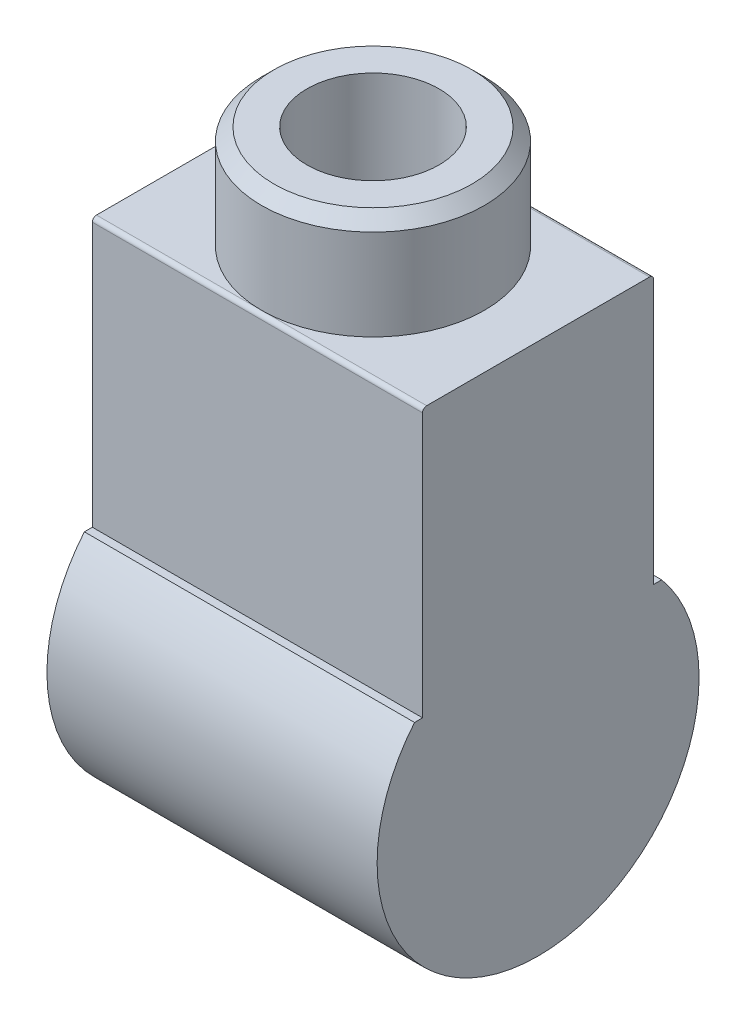
ISO-10303-21;
HEADER;
FILE_DESCRIPTION(('STEP AP214'),'2;1');
FILE_NAME('part.step','',(''),(''),'','','');
FILE_SCHEMA(('AUTOMOTIVE_DESIGN { 1 0 10303 214 1 1 1 1 }'));
ENDSEC;
DATA;
#1=APPLICATION_CONTEXT('core data for automotive mechanical design processes');
#2=APPLICATION_PROTOCOL_DEFINITION('international standard','automotive_design',2000,#1);
#3=PRODUCT_CONTEXT('',#1,'mechanical');
#4=PRODUCT('Part','Part','',(#3));
#5=PRODUCT_RELATED_PRODUCT_CATEGORY('part','',(#4));
#6=PRODUCT_DEFINITION_FORMATION('','',#4);
#7=PRODUCT_DEFINITION_CONTEXT('part definition',#1,'design');
#8=PRODUCT_DEFINITION('design','',#6,#7);
#9=PRODUCT_DEFINITION_SHAPE('','',#8);
#10=(LENGTH_UNIT() NAMED_UNIT(*) SI_UNIT(.MILLI.,.METRE.));
#11=(NAMED_UNIT(*) PLANE_ANGLE_UNIT() SI_UNIT($,.RADIAN.));
#12=(NAMED_UNIT(*) SI_UNIT($,.STERADIAN.) SOLID_ANGLE_UNIT());
#13=UNCERTAINTY_MEASURE_WITH_UNIT(LENGTH_MEASURE(1.E-05),#10,'distance_accuracy_value','');
#14=(GEOMETRIC_REPRESENTATION_CONTEXT(3) GLOBAL_UNCERTAINTY_ASSIGNED_CONTEXT((#13)) GLOBAL_UNIT_ASSIGNED_CONTEXT((#10,
#11,#12)) REPRESENTATION_CONTEXT('',''));
#15=CARTESIAN_POINT('',(0.,0.,0.));
#16=DIRECTION('',(0.,0.,1.));
#17=DIRECTION('',(1.,0.,0.));
#18=AXIS2_PLACEMENT_3D('',#15,#16,#17);
#19=CARTESIAN_POINT('',(2.,4.44999999999991,-1.34999999999991));
#20=DIRECTION('',(-1.,0.,0.));
#21=DIRECTION('',(0.,0.,1.));
#22=AXIS2_PLACEMENT_3D('',#19,#20,#21);
#23=CYLINDRICAL_SURFACE('',#22,0.0500000000000934);
#24=DIRECTION('',(1.,0.,0.));
#25=VECTOR('',#24,1.);
#26=CARTESIAN_POINT('',(2.,4.5,-1.34999999999991));
#27=LINE('',#26,#25);
#28=CARTESIAN_POINT('',(0.,4.5,-1.34999999999995));
#29=VERTEX_POINT('',#28);
#30=CARTESIAN_POINT('',(2.,4.5,-1.34999999999991));
#31=VERTEX_POINT('',#30);
#32=EDGE_CURVE('E156',#29,#31,#27,.T.);
#33=ORIENTED_EDGE('',*,*,#32,.T.);
#34=CARTESIAN_POINT('',(2.,4.44999999999991,-1.34999999999991));
#35=DIRECTION('',(-1.,0.,0.));
#36=DIRECTION('',(0.,0.,1.));
#37=AXIS2_PLACEMENT_3D('',#34,#35,#36);
#38=CIRCLE('',#37,0.0500000000000934);
#39=CARTESIAN_POINT('',(2.,4.44999999999991,-1.4));
#40=VERTEX_POINT('',#39);
#41=EDGE_CURVE('E205',#31,#40,#38,.T.);
#42=ORIENTED_EDGE('',*,*,#41,.T.);
#43=DIRECTION('',(1.,0.,0.));
#44=VECTOR('',#43,1.);
#45=CARTESIAN_POINT('',(2.,4.44999999999991,-1.4));
#46=LINE('',#45,#44);
#47=CARTESIAN_POINT('',(-2.,4.44999999999991,-1.4));
#48=VERTEX_POINT('',#47);
#49=EDGE_CURVE('E142',#40,#48,#46,.F.);
#50=ORIENTED_EDGE('',*,*,#49,.T.);
#51=CARTESIAN_POINT('',(-2.,4.44999999999991,-1.34999999999991));
#52=DIRECTION('',(-1.,0.,0.));
#53=DIRECTION('',(0.,0.,1.));
#54=AXIS2_PLACEMENT_3D('',#51,#52,#53);
#55=CIRCLE('',#54,0.0500000000000934);
#56=CARTESIAN_POINT('',(-2.,4.5,-1.34999999999991));
#57=VERTEX_POINT('',#56);
#58=EDGE_CURVE('E19',#48,#57,#55,.F.);
#59=ORIENTED_EDGE('',*,*,#58,.T.);
#60=DIRECTION('',(1.,0.,0.));
#61=VECTOR('',#60,1.);
#62=CARTESIAN_POINT('',(2.,4.5,-1.34999999999991));
#63=LINE('',#62,#61);
#64=EDGE_CURVE('E135',#57,#29,#63,.T.);
#65=ORIENTED_EDGE('',*,*,#64,.T.);
#66=EDGE_LOOP('',(#33,#42,#50,#59,#65));
#67=FACE_BOUND('',#66,.T.);
#68=ADVANCED_FACE('F16',(#67),#23,.T.);
#69=CARTESIAN_POINT('',(0.,4.45,0.));
#70=DIRECTION('',(0.,1.,0.));
#71=DIRECTION('',(0.,0.,1.));
#72=AXIS2_PLACEMENT_3D('',#69,#70,#71);
#73=CYLINDRICAL_SURFACE('',#72,1.35);
#74=CARTESIAN_POINT('',(0.,4.5,0.));
#75=DIRECTION('',(0.,1.,0.));
#76=DIRECTION('',(0.,0.,1.));
#77=AXIS2_PLACEMENT_3D('',#74,#75,#76);
#78=CIRCLE('',#77,1.35);
#79=CARTESIAN_POINT('',(0.,4.5,1.34999999999995));
#80=VERTEX_POINT('',#79);
#81=EDGE_CURVE('E151',#80,#29,#78,.T.);
#82=ORIENTED_EDGE('',*,*,#81,.T.);
#83=CARTESIAN_POINT('',(0.,4.5,0.));
#84=DIRECTION('',(0.,1.,0.));
#85=DIRECTION('',(0.,0.,1.));
#86=AXIS2_PLACEMENT_3D('',#83,#84,#85);
#87=CIRCLE('',#86,1.35);
#88=EDGE_CURVE('E101',#29,#80,#87,.T.);
#89=ORIENTED_EDGE('',*,*,#88,.T.);
#90=EDGE_LOOP('',(#82,#89));
#91=FACE_BOUND('',#90,.T.);
#92=CARTESIAN_POINT('',(0.,5.60000000001537,0.));
#93=DIRECTION('',(0.,-1.,0.));
#94=DIRECTION('',(0.,0.,-1.));
#95=AXIS2_PLACEMENT_3D('',#92,#93,#94);
#96=CIRCLE('',#95,1.35000000000218);
#97=CARTESIAN_POINT('',(0.,5.60000000001537,-1.35000000000218));
#98=VERTEX_POINT('',#97);
#99=EDGE_CURVE('E165',#98,#98,#96,.F.);
#100=ORIENTED_EDGE('',*,*,#99,.F.);
#101=EDGE_LOOP('',(#100));
#102=FACE_BOUND('',#101,.T.);
#103=ADVANCED_FACE('F235',(#91,#102),#73,.T.);
#104=CARTESIAN_POINT('',(2.,4.44999999999991,1.34999999999991));
#105=DIRECTION('',(-1.,0.,0.));
#106=DIRECTION('',(0.,0.,1.));
#107=AXIS2_PLACEMENT_3D('',#104,#105,#106);
#108=CYLINDRICAL_SURFACE('',#107,0.0500000000000934);
#109=DIRECTION('',(-1.,0.,0.));
#110=VECTOR('',#109,1.);
#111=CARTESIAN_POINT('',(2.,4.44999999999991,1.4));
#112=LINE('',#111,#110);
#113=CARTESIAN_POINT('',(-2.,4.44999999999991,1.4));
#114=VERTEX_POINT('',#113);
#115=CARTESIAN_POINT('',(2.,4.44999999999991,1.4));
#116=VERTEX_POINT('',#115);
#117=EDGE_CURVE('E100',#114,#116,#112,.F.);
#118=ORIENTED_EDGE('',*,*,#117,.T.);
#119=CARTESIAN_POINT('',(2.,4.44999999999991,1.34999999999991));
#120=DIRECTION('',(-1.,0.,0.));
#121=DIRECTION('',(0.,0.,1.));
#122=AXIS2_PLACEMENT_3D('',#119,#120,#121);
#123=CIRCLE('',#122,0.0500000000000934);
#124=CARTESIAN_POINT('',(2.,4.5,1.34999999999991));
#125=VERTEX_POINT('',#124);
#126=EDGE_CURVE('E113',#116,#125,#123,.T.);
#127=ORIENTED_EDGE('',*,*,#126,.T.);
#128=DIRECTION('',(1.,0.,0.));
#129=VECTOR('',#128,1.);
#130=CARTESIAN_POINT('',(2.,4.5,1.34999999999991));
#131=LINE('',#130,#129);
#132=EDGE_CURVE('E154',#125,#80,#131,.F.);
#133=ORIENTED_EDGE('',*,*,#132,.T.);
#134=DIRECTION('',(1.,0.,0.));
#135=VECTOR('',#134,1.);
#136=CARTESIAN_POINT('',(2.,4.5,1.34999999999991));
#137=LINE('',#136,#135);
#138=CARTESIAN_POINT('',(-2.,4.5,1.34999999999991));
#139=VERTEX_POINT('',#138);
#140=EDGE_CURVE('E138',#80,#139,#137,.F.);
#141=ORIENTED_EDGE('',*,*,#140,.T.);
#142=CARTESIAN_POINT('',(-2.,4.44999999999991,1.34999999999991));
#143=DIRECTION('',(-1.,0.,0.));
#144=DIRECTION('',(0.,0.,1.));
#145=AXIS2_PLACEMENT_3D('',#142,#143,#144);
#146=CIRCLE('',#145,0.0500000000000934);
#147=EDGE_CURVE('E204',#139,#114,#146,.F.);
#148=ORIENTED_EDGE('',*,*,#147,.T.);
#149=EDGE_LOOP('',(#118,#127,#133,#141,#148));
#150=FACE_BOUND('',#149,.T.);
#151=ADVANCED_FACE('F233',(#150),#108,.T.);
#152=CARTESIAN_POINT('',(0.,5.60000000001537,0.));
#153=DIRECTION('',(0.,-1.,0.));
#154=DIRECTION('',(0.,0.,-1.));
#155=AXIS2_PLACEMENT_3D('',#152,#153,#154);
#156=CONICAL_SURFACE('',#155,1.35000000000218,0.785398163397448);
#157=CARTESIAN_POINT('',(0.,5.75000000003456,0.));
#158=DIRECTION('',(0.,-1.,0.));
#159=DIRECTION('',(0.,0.,-1.));
#160=AXIS2_PLACEMENT_3D('',#157,#158,#159);
#161=CIRCLE('',#160,1.19999999998299);
#162=CARTESIAN_POINT('',(0.,5.75000000003456,-1.19999999998299));
#163=VERTEX_POINT('',#162);
#164=EDGE_CURVE('E131',#163,#163,#161,.T.);
#165=ORIENTED_EDGE('',*,*,#164,.T.);
#166=EDGE_LOOP('',(#165));
#167=FACE_BOUND('',#166,.T.);
#168=ORIENTED_EDGE('',*,*,#99,.T.);
#169=EDGE_LOOP('',(#168));
#170=FACE_BOUND('',#169,.T.);
#171=ADVANCED_FACE('F240',(#167,#170),#156,.T.);
#172=CARTESIAN_POINT('',(2.,1.25,-1.4966629547096));
#173=DIRECTION('',(0.,-1.,0.));
#174=DIRECTION('',(0.,0.,-1.));
#175=AXIS2_PLACEMENT_3D('',#172,#173,#174);
#176=PLANE('',#175);
#177=DIRECTION('',(0.,0.,-1.));
#178=VECTOR('',#177,1.);
#179=CARTESIAN_POINT('',(-2.,1.25,-1.4966629547096));
#180=LINE('',#179,#178);
#181=CARTESIAN_POINT('',(-2.,1.25,-1.4));
#182=VERTEX_POINT('',#181);
#183=CARTESIAN_POINT('',(-2.,1.25,-1.4966629547096));
#184=VERTEX_POINT('',#183);
#185=EDGE_CURVE('E83',#182,#184,#180,.T.);
#186=ORIENTED_EDGE('',*,*,#185,.F.);
#187=DIRECTION('',(1.,0.,0.));
#188=VECTOR('',#187,1.);
#189=CARTESIAN_POINT('',(2.,1.25,-1.4));
#190=LINE('',#189,#188);
#191=CARTESIAN_POINT('',(2.,1.25,-1.4));
#192=VERTEX_POINT('',#191);
#193=EDGE_CURVE('E141',#182,#192,#190,.T.);
#194=ORIENTED_EDGE('',*,*,#193,.T.);
#195=DIRECTION('',(0.,0.,-1.));
#196=VECTOR('',#195,1.);
#197=CARTESIAN_POINT('',(2.,1.25,-1.4966629547096));
#198=LINE('',#197,#196);
#199=CARTESIAN_POINT('',(2.,1.25,-1.4966629547096));
#200=VERTEX_POINT('',#199);
#201=EDGE_CURVE('E160',#200,#192,#198,.F.);
#202=ORIENTED_EDGE('',*,*,#201,.F.);
#203=DIRECTION('',(-1.,0.,0.));
#204=VECTOR('',#203,1.);
#205=CARTESIAN_POINT('',(2.,1.25,-1.4966629547096));
#206=LINE('',#205,#204);
#207=EDGE_CURVE('E126',#184,#200,#206,.F.);
#208=ORIENTED_EDGE('',*,*,#207,.F.);
#209=EDGE_LOOP('',(#186,#194,#202,#208));
#210=FACE_BOUND('',#209,.T.);
#211=ADVANCED_FACE('F225',(#210),#176,.F.);
#212=CARTESIAN_POINT('',(2.,4.5,-1.34999999999991));
#213=DIRECTION('',(0.,-1.,0.));
#214=DIRECTION('',(0.,0.,-1.));
#215=AXIS2_PLACEMENT_3D('',#212,#213,#214);
#216=PLANE('',#215);
#217=ORIENTED_EDGE('',*,*,#132,.F.);
#218=DIRECTION('',(0.,0.,-1.));
#219=VECTOR('',#218,1.);
#220=CARTESIAN_POINT('',(2.,4.5,0.));
#221=LINE('',#220,#219);
#222=EDGE_CURVE('E115',#31,#125,#221,.F.);
#223=ORIENTED_EDGE('',*,*,#222,.F.);
#224=ORIENTED_EDGE('',*,*,#32,.F.);
#225=ORIENTED_EDGE('',*,*,#81,.F.);
#226=EDGE_LOOP('',(#217,#223,#224,#225));
#227=FACE_BOUND('',#226,.T.);
#228=ADVANCED_FACE('F231',(#227),#216,.F.);
#229=CARTESIAN_POINT('',(2.,1.25,1.4));
#230=DIRECTION('',(0.,-1.,0.));
#231=DIRECTION('',(0.,0.,-1.));
#232=AXIS2_PLACEMENT_3D('',#229,#230,#231);
#233=PLANE('',#232);
#234=DIRECTION('',(0.,0.,-1.));
#235=VECTOR('',#234,1.);
#236=CARTESIAN_POINT('',(-2.,1.25,1.4));
#237=LINE('',#236,#235);
#238=CARTESIAN_POINT('',(-2.,1.25,1.4966629547096));
#239=VERTEX_POINT('',#238);
#240=CARTESIAN_POINT('',(-2.,1.25,1.4));
#241=VERTEX_POINT('',#240);
#242=EDGE_CURVE('E144',#239,#241,#237,.T.);
#243=ORIENTED_EDGE('',*,*,#242,.F.);
#244=DIRECTION('',(-1.,0.,0.));
#245=VECTOR('',#244,1.);
#246=CARTESIAN_POINT('',(2.,1.25,1.4966629547096));
#247=LINE('',#246,#245);
#248=CARTESIAN_POINT('',(2.,1.25,1.4966629547096));
#249=VERTEX_POINT('',#248);
#250=EDGE_CURVE('E108',#249,#239,#247,.T.);
#251=ORIENTED_EDGE('',*,*,#250,.F.);
#252=DIRECTION('',(0.,0.,-1.));
#253=VECTOR('',#252,1.);
#254=CARTESIAN_POINT('',(2.,1.25,0.));
#255=LINE('',#254,#253);
#256=CARTESIAN_POINT('',(2.,1.25,1.4));
#257=VERTEX_POINT('',#256);
#258=EDGE_CURVE('E105',#257,#249,#255,.F.);
#259=ORIENTED_EDGE('',*,*,#258,.F.);
#260=DIRECTION('',(-1.,0.,0.));
#261=VECTOR('',#260,1.);
#262=CARTESIAN_POINT('',(2.,1.25,1.4));
#263=LINE('',#262,#261);
#264=EDGE_CURVE('E91',#257,#241,#263,.T.);
#265=ORIENTED_EDGE('',*,*,#264,.T.);
#266=EDGE_LOOP('',(#243,#251,#259,#265));
#267=FACE_BOUND('',#266,.T.);
#268=ADVANCED_FACE('F106',(#267),#233,.F.);
#269=CARTESIAN_POINT('',(2.,1.25,-1.4));
#270=DIRECTION('',(0.,0.,1.));
#271=DIRECTION('',(1.,0.,0.));
#272=AXIS2_PLACEMENT_3D('',#269,#270,#271);
#273=PLANE('',#272);
#274=DIRECTION('',(0.,1.,0.));
#275=VECTOR('',#274,1.);
#276=CARTESIAN_POINT('',(-2.,0.,-1.4));
#277=LINE('',#276,#275);
#278=EDGE_CURVE('E130',#182,#48,#277,.T.);
#279=ORIENTED_EDGE('',*,*,#278,.T.);
#280=ORIENTED_EDGE('',*,*,#49,.F.);
#281=DIRECTION('',(0.,1.,0.));
#282=VECTOR('',#281,1.);
#283=CARTESIAN_POINT('',(2.,0.,-1.4));
#284=LINE('',#283,#282);
#285=EDGE_CURVE('E117',#192,#40,#284,.T.);
#286=ORIENTED_EDGE('',*,*,#285,.F.);
#287=ORIENTED_EDGE('',*,*,#193,.F.);
#288=EDGE_LOOP('',(#279,#280,#286,#287));
#289=FACE_BOUND('',#288,.T.);
#290=ADVANCED_FACE('F223',(#289),#273,.F.);
#291=CARTESIAN_POINT('',(2.,4.5,-1.34999999999991));
#292=DIRECTION('',(0.,-1.,0.));
#293=DIRECTION('',(0.,0.,-1.));
#294=AXIS2_PLACEMENT_3D('',#291,#292,#293);
#295=PLANE('',#294);
#296=ORIENTED_EDGE('',*,*,#64,.F.);
#297=DIRECTION('',(0.,0.,-1.));
#298=VECTOR('',#297,1.);
#299=CARTESIAN_POINT('',(-2.,4.5,0.));
#300=LINE('',#299,#298);
#301=EDGE_CURVE('E214',#57,#139,#300,.F.);
#302=ORIENTED_EDGE('',*,*,#301,.T.);
#303=ORIENTED_EDGE('',*,*,#140,.F.);
#304=ORIENTED_EDGE('',*,*,#88,.F.);
#305=EDGE_LOOP('',(#296,#302,#303,#304));
#306=FACE_BOUND('',#305,.T.);
#307=ADVANCED_FACE('F212',(#306),#295,.F.);
#308=CARTESIAN_POINT('',(2.,4.44999999999991,1.4));
#309=DIRECTION('',(0.,0.,-1.));
#310=DIRECTION('',(-1.,0.,0.));
#311=AXIS2_PLACEMENT_3D('',#308,#309,#310);
#312=PLANE('',#311);
#313=DIRECTION('',(0.,1.,0.));
#314=VECTOR('',#313,1.);
#315=CARTESIAN_POINT('',(-2.,0.,1.4));
#316=LINE('',#315,#314);
#317=EDGE_CURVE('E98',#114,#241,#316,.F.);
#318=ORIENTED_EDGE('',*,*,#317,.T.);
#319=ORIENTED_EDGE('',*,*,#264,.F.);
#320=DIRECTION('',(0.,1.,0.));
#321=VECTOR('',#320,1.);
#322=CARTESIAN_POINT('',(2.,0.,1.4));
#323=LINE('',#322,#321);
#324=EDGE_CURVE('E96',#116,#257,#323,.F.);
#325=ORIENTED_EDGE('',*,*,#324,.F.);
#326=ORIENTED_EDGE('',*,*,#117,.F.);
#327=EDGE_LOOP('',(#318,#319,#325,#326));
#328=FACE_BOUND('',#327,.T.);
#329=ADVANCED_FACE('F93',(#328),#312,.F.);
#330=CARTESIAN_POINT('',(0.,5.75,0.));
#331=DIRECTION('',(0.,-1.,0.));
#332=DIRECTION('',(0.,0.,-1.));
#333=AXIS2_PLACEMENT_3D('',#330,#331,#332);
#334=PLANE('',#333);
#335=ORIENTED_EDGE('',*,*,#164,.F.);
#336=EDGE_LOOP('',(#335));
#337=FACE_BOUND('',#336,.T.);
#338=CARTESIAN_POINT('',(0.,5.75,0.));
#339=DIRECTION('',(0.,1.,0.));
#340=DIRECTION('',(0.,0.,1.));
#341=AXIS2_PLACEMENT_3D('',#338,#339,#340);
#342=CIRCLE('',#341,0.799999999999993);
#343=CARTESIAN_POINT('',(0.,5.75,0.799999999999993));
#344=VERTEX_POINT('',#343);
#345=EDGE_CURVE('E193',#344,#344,#342,.F.);
#346=ORIENTED_EDGE('',*,*,#345,.T.);
#347=EDGE_LOOP('',(#346));
#348=FACE_BOUND('',#347,.T.);
#349=ADVANCED_FACE('F261',(#337,#348),#334,.F.);
#350=CARTESIAN_POINT('',(2.,0.,0.));
#351=DIRECTION('',(1.,0.,0.));
#352=DIRECTION('',(0.,0.,-1.));
#353=AXIS2_PLACEMENT_3D('',#350,#351,#352);
#354=PLANE('',#353);
#355=ORIENTED_EDGE('',*,*,#324,.T.);
#356=ORIENTED_EDGE('',*,*,#258,.T.);
#357=CARTESIAN_POINT('',(2.,0.,0.));
#358=DIRECTION('',(-1.,0.,0.));
#359=DIRECTION('',(0.,0.,1.));
#360=AXIS2_PLACEMENT_3D('',#357,#358,#359);
#361=CIRCLE('',#360,1.95000000000001);
#362=EDGE_CURVE('E191',#200,#249,#361,.T.);
#363=ORIENTED_EDGE('',*,*,#362,.F.);
#364=ORIENTED_EDGE('',*,*,#201,.T.);
#365=ORIENTED_EDGE('',*,*,#285,.T.);
#366=ORIENTED_EDGE('',*,*,#41,.F.);
#367=ORIENTED_EDGE('',*,*,#222,.T.);
#368=ORIENTED_EDGE('',*,*,#126,.F.);
#369=EDGE_LOOP('',(#355,#356,#363,#364,#365,#366,#367,#368));
#370=FACE_BOUND('',#369,.T.);
#371=ADVANCED_FACE('F111',(#370),#354,.T.);
#372=CARTESIAN_POINT('',(-2.,0.,0.));
#373=DIRECTION('',(1.,0.,0.));
#374=DIRECTION('',(0.,0.,-1.));
#375=AXIS2_PLACEMENT_3D('',#372,#373,#374);
#376=PLANE('',#375);
#377=ORIENTED_EDGE('',*,*,#242,.T.);
#378=ORIENTED_EDGE('',*,*,#317,.F.);
#379=ORIENTED_EDGE('',*,*,#147,.F.);
#380=ORIENTED_EDGE('',*,*,#301,.F.);
#381=ORIENTED_EDGE('',*,*,#58,.F.);
#382=ORIENTED_EDGE('',*,*,#278,.F.);
#383=ORIENTED_EDGE('',*,*,#185,.T.);
#384=CARTESIAN_POINT('',(-2.,0.,0.));
#385=DIRECTION('',(-1.,0.,0.));
#386=DIRECTION('',(0.,0.,1.));
#387=AXIS2_PLACEMENT_3D('',#384,#385,#386);
#388=CIRCLE('',#387,1.95000000000001);
#389=EDGE_CURVE('E25',#239,#184,#388,.F.);
#390=ORIENTED_EDGE('',*,*,#389,.F.);
#391=EDGE_LOOP('',(#377,#378,#379,#380,#381,#382,#383,#390));
#392=FACE_BOUND('',#391,.T.);
#393=ADVANCED_FACE('F187',(#392),#376,.F.);
#394=CARTESIAN_POINT('',(0.,5.75,0.));
#395=DIRECTION('',(0.,1.,0.));
#396=DIRECTION('',(0.,0.,1.));
#397=AXIS2_PLACEMENT_3D('',#394,#395,#396);
#398=CYLINDRICAL_SURFACE('',#397,0.799999999999993);
#399=ORIENTED_EDGE('',*,*,#345,.F.);
#400=EDGE_LOOP('',(#399));
#401=FACE_BOUND('',#400,.T.);
#402=CARTESIAN_POINT('',(-4.78415312996385E-13,-1.77834192437788,0.799999999999993));
#403=CARTESIAN_POINT('',(0.0427843406647108,-1.77834468559484,0.799997347966624));
#404=CARTESIAN_POINT('',(0.0856057611680604,-1.77990648383502,0.796549855364519));
#405=CARTESIAN_POINT('',(0.169979889243121,-1.7859488133926,0.782904477605013));
#406=CARTESIAN_POINT('',(0.211530616766994,-1.7904336788792,0.772696568096673));
#407=CARTESIAN_POINT('',(0.292046441601393,-1.80172303373258,0.745990419895769));
#408=CARTESIAN_POINT('',(0.331020075611976,-1.80851935358356,0.729514311287739));
#409=CARTESIAN_POINT('',(0.405652446295706,-1.8236544315319,0.690807340908591));
#410=CARTESIAN_POINT('',(0.441310951444537,-1.83199329723725,0.668576077614629));
#411=CARTESIAN_POINT('',(0.510452037298317,-1.84983362858024,0.617562477572965));
#412=CARTESIAN_POINT('',(0.543709962864704,-1.85937369377611,0.588489035874304));
#413=CARTESIAN_POINT('',(0.60504143764398,-1.87822309818955,0.525230058072546));
#414=CARTESIAN_POINT('',(0.633113419639479,-1.88753236692582,0.491042982234451));
#415=CARTESIAN_POINT('',(0.684415499885961,-1.90534007929139,0.416768044791706));
#416=CARTESIAN_POINT('',(0.707393749574582,-1.91378827441062,0.376493090260618));
#417=CARTESIAN_POINT('',(0.746152327836683,-1.92845016181551,0.292239892980411));
#418=CARTESIAN_POINT('',(0.761935664050113,-1.93466478755445,0.248263206764783));
#419=CARTESIAN_POINT('',(0.785044946754069,-1.94388503320455,0.160217619180366));
#420=CARTESIAN_POINT('',(0.792758711426506,-1.94703722442635,0.116266169051578));
#421=CARTESIAN_POINT('',(0.800761356628295,-1.95030882232469,0.0275872081788017));
#422=CARTESIAN_POINT('',(0.801053144960191,-1.95042941672846,-0.0171399917668341));
#423=CARTESIAN_POINT('',(0.794410384536674,-1.94771163578851,-0.103287697416572));
#424=CARTESIAN_POINT('',(0.787901424075325,-1.94504752228333,-0.144747534091999));
#425=CARTESIAN_POINT('',(0.76856927329937,-1.93729726301786,-0.225926134107314));
#426=CARTESIAN_POINT('',(0.755745619255553,-1.93221093937975,-0.265644769346081));
#427=CARTESIAN_POINT('',(0.723993143763123,-1.92001267552108,-0.342938516112574));
#428=CARTESIAN_POINT('',(0.704974373699377,-1.91287108413079,-0.38047180330399));
#429=CARTESIAN_POINT('',(0.66145872927881,-1.89726532098806,-0.451910666442757));
#430=CARTESIAN_POINT('',(0.636960132581204,-1.88880073366299,-0.485815096855276));
#431=CARTESIAN_POINT('',(0.581226913435407,-1.87071741286178,-0.55150281310195));
#432=CARTESIAN_POINT('',(0.549645825593301,-1.86105933833608,-0.58298171012588));
#433=CARTESIAN_POINT('',(0.481614599783333,-1.84211471531195,-0.640334249013311));
#434=CARTESIAN_POINT('',(0.445161406985707,-1.83282840469729,-0.666204347232557));
#435=CARTESIAN_POINT('',(0.366978005074816,-1.81539980949877,-0.712357069565609));
#436=CARTESIAN_POINT('',(0.32511725948648,-1.80730305599859,-0.732436850554013));
#437=CARTESIAN_POINT('',(0.238225227854955,-1.79371828514385,-0.765109568639836));
#438=CARTESIAN_POINT('',(0.193201047320975,-1.78822462322068,-0.777718720136864));
#439=CARTESIAN_POINT('',(0.123101623390093,-1.78243246314629,-0.790857940577565));
#440=CARTESIAN_POINT('',(0.0986362978159116,-1.78090574989511,-0.794280180815845));
#441=CARTESIAN_POINT('',(0.0494514425436005,-1.7788596895653,-0.798851960960791));
#442=CARTESIAN_POINT('',(0.0247319164483635,-1.77834032822876,-0.800001533034447));
#443=CARTESIAN_POINT('',(-0.0427843406651949,-1.77834468559485,-0.799997347966598));
#444=CARTESIAN_POINT('',(-0.0856057611685473,-1.77990648383504,-0.796549855364467));
#445=CARTESIAN_POINT('',(-0.169979889243608,-1.78594881339264,-0.782904477604908));
#446=CARTESIAN_POINT('',(-0.211530616767479,-1.79043367887926,-0.772696568096541));
#447=CARTESIAN_POINT('',(-0.292046441601868,-1.80172303373265,-0.745990419895583));
#448=CARTESIAN_POINT('',(-0.331020075612445,-1.80851935358365,-0.729514311287527));
#449=CARTESIAN_POINT('',(-0.405652446296156,-1.823654431532,-0.690807340908326));
#450=CARTESIAN_POINT('',(-0.441310951444976,-1.83199329723736,-0.668576077614339));
#451=CARTESIAN_POINT('',(-0.510452037298731,-1.84983362858036,-0.617562477572623));
#452=CARTESIAN_POINT('',(-0.543709962865103,-1.85937369377623,-0.588489035873935));
#453=CARTESIAN_POINT('',(-0.605041437644346,-1.87822309818966,-0.525230058072124));
#454=CARTESIAN_POINT('',(-0.633113419639827,-1.88753236692593,-0.491042982234004));
#455=CARTESIAN_POINT('',(-0.68441549988626,-1.9053400792915,-0.416768044791215));
#456=CARTESIAN_POINT('',(-0.707393749574853,-1.91378827441072,-0.37649309026011));
#457=CARTESIAN_POINT('',(-0.746152327836893,-1.92845016181559,-0.292239892979874));
#458=CARTESIAN_POINT('',(-0.761935664050292,-1.93466478755452,-0.248263206764234));
#459=CARTESIAN_POINT('',(-0.785044946754183,-1.9438850332046,-0.160217619179805));
#460=CARTESIAN_POINT('',(-0.792758711426587,-1.94703722442639,-0.116266169051019));
#461=CARTESIAN_POINT('',(-0.800761356628314,-1.9503088223247,-0.0275872081782503));
#462=CARTESIAN_POINT('',(-0.801053144960179,-1.95042941672845,0.0171399917673782));
#463=CARTESIAN_POINT('',(-0.794410384536605,-1.94771163578848,0.103287697417102));
#464=CARTESIAN_POINT('',(-0.787901424075229,-1.94504752228329,0.144747534092521));
#465=CARTESIAN_POINT('',(-0.768569273299222,-1.9372972630178,0.225926134107816));
#466=CARTESIAN_POINT('',(-0.75574561925538,-1.93221093937968,0.265644769346572));
#467=CARTESIAN_POINT('',(-0.7239931437629,-1.920012675521,0.342938516113044));
#468=CARTESIAN_POINT('',(-0.704974373699129,-1.9128710841307,0.38047180330445));
#469=CARTESIAN_POINT('',(-0.661458729278511,-1.89726532098796,0.451910666443196));
#470=CARTESIAN_POINT('',(-0.636960132580881,-1.88880073366288,0.4858150968557));
#471=CARTESIAN_POINT('',(-0.581226913435033,-1.87071741286166,0.551502813102345));
#472=CARTESIAN_POINT('',(-0.549645825592901,-1.86105933833596,0.582981710126257));
#473=CARTESIAN_POINT('',(-0.481614599782883,-1.84211471531183,0.640334249013649));
#474=CARTESIAN_POINT('',(-0.445161406985234,-1.83282840469717,0.666204347232874));
#475=CARTESIAN_POINT('',(-0.366978005074303,-1.81539980949866,0.712357069565873));
#476=CARTESIAN_POINT('',(-0.325117259485953,-1.80730305599849,0.732436850554247));
#477=CARTESIAN_POINT('',(-0.238225227854405,-1.79371828514377,0.765109568640008));
#478=CARTESIAN_POINT('',(-0.193201047320416,-1.78822462322062,0.777718720137003));
#479=CARTESIAN_POINT('',(-0.123101623389697,-1.78243246314626,0.790857940577621));
#480=CARTESIAN_POINT('',(-0.0986362978156885,-1.7809057498951,0.794280180815867));
#481=CARTESIAN_POINT('',(-0.0494514425437267,-1.77885968956531,0.798851960960777));
#482=CARTESIAN_POINT('',(-0.0247319164486662,-1.77834032822877,0.800001533034433));
#483=CARTESIAN_POINT('',(-4.78415312996385E-13,-1.77834192437788,0.799999999999993));
#484=B_SPLINE_CURVE_WITH_KNOTS('',3,(#402,#403,#404,#405,#406,#407,#408,#409,#410,#411,#412,
#413,#414,#415,#416,#417,#418,#419,#420,#421,#422,#423,#424,#425,#426,#427,#428,#429,#430,#431,
#432,#433,#434,#435,#436,#437,#438,#439,#440,#441,#442,#443,#444,#445,#446,#447,#448,#449,#450,
#451,#452,#453,#454,#455,#456,#457,#458,#459,#460,#461,#462,#463,#464,#465,#466,#467,#468,#469,
#470,#471,#472,#473,#474,#475,#476,#477,#478,#479,#480,#481,#482,#483),.UNSPECIFIED.,.T.,.F.,(4,
2,2,2,2,2,2,2,2,2,2,2,2,2,2,2,2,2,2,2,2,2,2,2,2,2,2,2,2,2,2,2,2,2,2,2,2,2,2,2,4),(0.,
0.128255356300858,0.256701316812822,0.384697940868076,0.512703497337538,0.647688577704174,
0.782714384724617,0.923391957277382,1.06401066930897,1.19750822618542,1.33095348021164,
1.45652082326642,1.58209738892716,1.70958519797108,1.83711313360699,1.97337677699535,
2.10972626260543,2.25039281177882,2.39075292636375,2.46489326845465,2.53903256116715,
2.66728791746802,2.79573387798,2.92373050203527,3.05173605850475,3.18672113887141,
3.32174694589187,3.46242451844463,3.60304323047621,3.73654078735265,3.86998604137885,
3.99555338443362,4.12112995009435,4.24861775913828,4.37614569477421,4.51240933816259,
4.64875882377268,4.78942537294607,4.92978548753099,5.00392582962137,5.07806512233334),.UNSPECIFIED.);
#485=CARTESIAN_POINT('',(-4.78415312996385E-13,-1.77834192437788,0.799999999999993));
#486=VERTEX_POINT('',#485);
#487=EDGE_CURVE('E11',#486,#486,#484,.T.);
#488=ORIENTED_EDGE('',*,*,#487,.F.);
#489=EDGE_LOOP('',(#488));
#490=FACE_BOUND('',#489,.T.);
#491=ADVANCED_FACE('F176',(#401,#490),#398,.F.);
#492=CARTESIAN_POINT('',(2.,0.,0.));
#493=DIRECTION('',(-1.,0.,0.));
#494=DIRECTION('',(0.,0.,1.));
#495=AXIS2_PLACEMENT_3D('',#492,#493,#494);
#496=CYLINDRICAL_SURFACE('',#495,1.95000000000001);
#497=ORIENTED_EDGE('',*,*,#487,.T.);
#498=EDGE_LOOP('',(#497));
#499=FACE_BOUND('',#498,.T.);
#500=ORIENTED_EDGE('',*,*,#362,.T.);
#501=ORIENTED_EDGE('',*,*,#250,.T.);
#502=ORIENTED_EDGE('',*,*,#389,.T.);
#503=ORIENTED_EDGE('',*,*,#207,.T.);
#504=EDGE_LOOP('',(#500,#501,#502,#503));
#505=FACE_BOUND('',#504,.T.);
#506=ADVANCED_FACE('F179',(#499,#505),#496,.T.);
#507=CLOSED_SHELL('',(#68,#103,#151,#171,#211,#228,#268,#290,#307,#329,#349,#371,#393,#491,#506));
#508=MANIFOLD_SOLID_BREP('B1',#507);
#509=ADVANCED_BREP_SHAPE_REPRESENTATION('',(#18,#508),#14);
#510=SHAPE_DEFINITION_REPRESENTATION(#9,#509);
ENDSEC;
END-ISO-10303-21;
